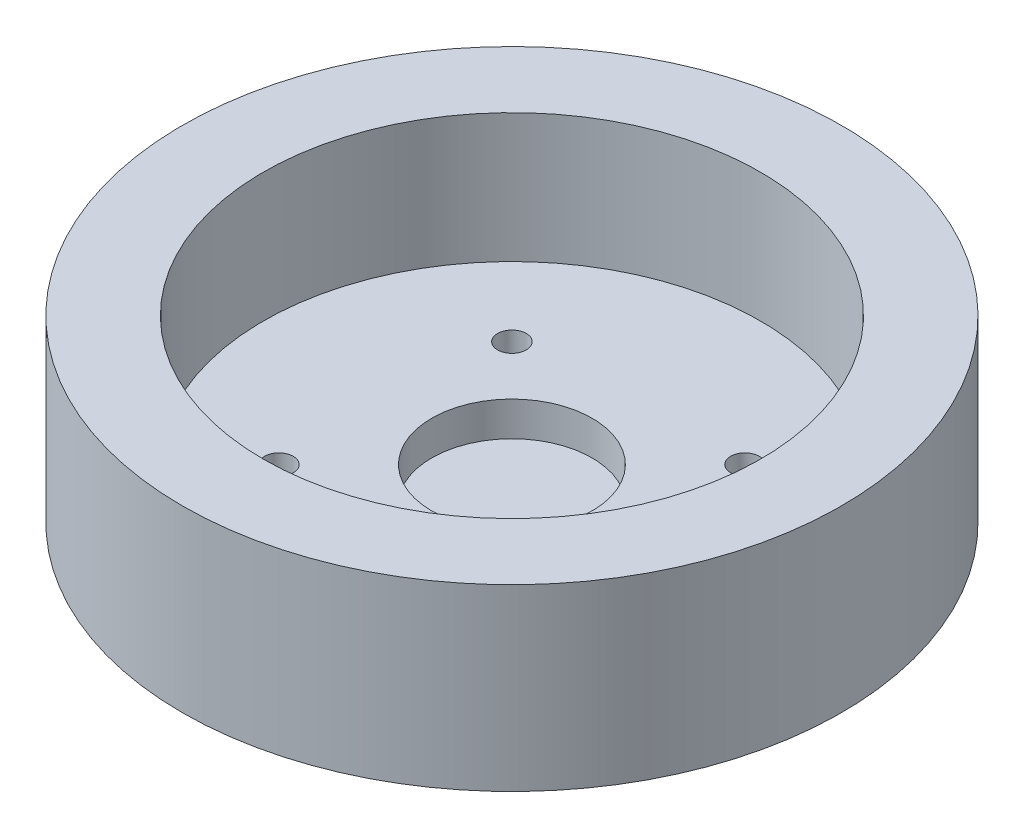
ISO-10303-21;
HEADER;
FILE_DESCRIPTION(('STEP AP214'),'2;1');
FILE_NAME('part.step','',(''),(''),'','','');
FILE_SCHEMA(('AUTOMOTIVE_DESIGN { 1 0 10303 214 1 1 1 1 }'));
ENDSEC;
DATA;
#1=APPLICATION_CONTEXT('core data for automotive mechanical design processes');
#2=APPLICATION_PROTOCOL_DEFINITION('international standard','automotive_design',2000,#1);
#3=PRODUCT_CONTEXT('',#1,'mechanical');
#4=PRODUCT('Part','Part','',(#3));
#5=PRODUCT_RELATED_PRODUCT_CATEGORY('part','',(#4));
#6=PRODUCT_DEFINITION_FORMATION('','',#4);
#7=PRODUCT_DEFINITION_CONTEXT('part definition',#1,'design');
#8=PRODUCT_DEFINITION('design','',#6,#7);
#9=PRODUCT_DEFINITION_SHAPE('','',#8);
#10=(LENGTH_UNIT() NAMED_UNIT(*) SI_UNIT(.MILLI.,.METRE.));
#11=(NAMED_UNIT(*) PLANE_ANGLE_UNIT() SI_UNIT($,.RADIAN.));
#12=(NAMED_UNIT(*) SI_UNIT($,.STERADIAN.) SOLID_ANGLE_UNIT());
#13=UNCERTAINTY_MEASURE_WITH_UNIT(LENGTH_MEASURE(1.E-05),#10,'distance_accuracy_value','');
#14=(GEOMETRIC_REPRESENTATION_CONTEXT(3) GLOBAL_UNCERTAINTY_ASSIGNED_CONTEXT((#13)) GLOBAL_UNIT_ASSIGNED_CONTEXT((#10,
#11,#12)) REPRESENTATION_CONTEXT('',''));
#15=CARTESIAN_POINT('',(0.,0.,0.));
#16=DIRECTION('',(0.,0.,1.));
#17=DIRECTION('',(1.,0.,0.));
#18=AXIS2_PLACEMENT_3D('',#15,#16,#17);
#19=CARTESIAN_POINT('',(8.13172798364529,-5.,-8.1317279836453));
#20=DIRECTION('',(0.,1.,0.));
#21=DIRECTION('',(0.,0.,1.));
#22=AXIS2_PLACEMENT_3D('',#19,#20,#21);
#23=CYLINDRICAL_SURFACE('',#22,1.);
#24=CARTESIAN_POINT('',(8.13172798364529,3.5,-8.1317279836453));
#25=DIRECTION('',(0.,1.,0.));
#26=DIRECTION('',(0.,0.,1.));
#27=AXIS2_PLACEMENT_3D('',#24,#25,#26);
#28=CIRCLE('',#27,1.);
#29=CARTESIAN_POINT('',(8.13172798364529,3.5,-7.13172798364529));
#30=VERTEX_POINT('',#29);
#31=EDGE_CURVE('E68',#30,#30,#28,.T.);
#32=ORIENTED_EDGE('',*,*,#31,.T.);
#33=EDGE_LOOP('',(#32));
#34=FACE_BOUND('',#33,.T.);
#35=CARTESIAN_POINT('',(8.13172798364529,1.9,-8.1317279836453));
#36=DIRECTION('',(0.,-1.,0.));
#37=DIRECTION('',(0.,0.,-1.));
#38=AXIS2_PLACEMENT_3D('',#35,#36,#37);
#39=CIRCLE('',#38,1.);
#40=CARTESIAN_POINT('',(8.13172798364529,1.9,-9.1317279836453));
#41=VERTEX_POINT('',#40);
#42=EDGE_CURVE('E44',#41,#41,#39,.F.);
#43=ORIENTED_EDGE('',*,*,#42,.F.);
#44=EDGE_LOOP('',(#43));
#45=FACE_BOUND('',#44,.T.);
#46=ADVANCED_FACE('F40',(#34,#45),#23,.F.);
#47=CARTESIAN_POINT('',(7.42462120245875,-5.,7.42462120245875));
#48=DIRECTION('',(0.,1.,0.));
#49=DIRECTION('',(0.,0.,1.));
#50=AXIS2_PLACEMENT_3D('',#47,#48,#49);
#51=CYLINDRICAL_SURFACE('',#50,0.999999999982254);
#52=CARTESIAN_POINT('',(7.42462120245875,3.5,7.42462120245875));
#53=DIRECTION('',(0.,1.,0.));
#54=DIRECTION('',(0.,0.,1.));
#55=AXIS2_PLACEMENT_3D('',#52,#53,#54);
#56=CIRCLE('',#55,0.999999999982254);
#57=CARTESIAN_POINT('',(7.42462120245875,3.5,8.424621202441));
#58=VERTEX_POINT('',#57);
#59=EDGE_CURVE('E72',#58,#58,#56,.T.);
#60=ORIENTED_EDGE('',*,*,#59,.T.);
#61=EDGE_LOOP('',(#60));
#62=FACE_BOUND('',#61,.T.);
#63=CARTESIAN_POINT('',(7.42462120245875,1.9,7.42462120245875));
#64=DIRECTION('',(0.,-1.,0.));
#65=DIRECTION('',(0.,0.,-1.));
#66=AXIS2_PLACEMENT_3D('',#63,#64,#65);
#67=CIRCLE('',#66,0.999999999982254);
#68=CARTESIAN_POINT('',(7.42462120245875,1.9,6.42462120247649));
#69=VERTEX_POINT('',#68);
#70=EDGE_CURVE('E63',#69,#69,#67,.F.);
#71=ORIENTED_EDGE('',*,*,#70,.F.);
#72=EDGE_LOOP('',(#71));
#73=FACE_BOUND('',#72,.T.);
#74=ADVANCED_FACE('F124',(#62,#73),#51,.F.);
#75=CARTESIAN_POINT('',(-8.13172798364529,-5.,8.1317279836453));
#76=DIRECTION('',(0.,1.,0.));
#77=DIRECTION('',(0.,0.,1.));
#78=AXIS2_PLACEMENT_3D('',#75,#76,#77);
#79=CYLINDRICAL_SURFACE('',#78,1.);
#80=CARTESIAN_POINT('',(-8.13172798364529,3.5,8.1317279836453));
#81=DIRECTION('',(0.,1.,0.));
#82=DIRECTION('',(0.,0.,1.));
#83=AXIS2_PLACEMENT_3D('',#80,#81,#82);
#84=CIRCLE('',#83,1.);
#85=CARTESIAN_POINT('',(-8.13172798364529,3.5,9.1317279836453));
#86=VERTEX_POINT('',#85);
#87=EDGE_CURVE('E77',#86,#86,#84,.T.);
#88=ORIENTED_EDGE('',*,*,#87,.T.);
#89=EDGE_LOOP('',(#88));
#90=FACE_BOUND('',#89,.T.);
#91=CARTESIAN_POINT('',(-8.13172798364529,1.9,8.1317279836453));
#92=DIRECTION('',(0.,-1.,0.));
#93=DIRECTION('',(0.,0.,-1.));
#94=AXIS2_PLACEMENT_3D('',#91,#92,#93);
#95=CIRCLE('',#94,1.);
#96=CARTESIAN_POINT('',(-8.13172798364529,1.9,7.1317279836453));
#97=VERTEX_POINT('',#96);
#98=EDGE_CURVE('E60',#97,#97,#95,.F.);
#99=ORIENTED_EDGE('',*,*,#98,.F.);
#100=EDGE_LOOP('',(#99));
#101=FACE_BOUND('',#100,.T.);
#102=ADVANCED_FACE('F129',(#90,#101),#79,.F.);
#103=CARTESIAN_POINT('',(-7.42462120245874,-5.,-7.42462120245876));
#104=DIRECTION('',(0.,1.,0.));
#105=DIRECTION('',(0.,0.,1.));
#106=AXIS2_PLACEMENT_3D('',#103,#104,#105);
#107=CYLINDRICAL_SURFACE('',#106,1.);
#108=CARTESIAN_POINT('',(-7.42462120245874,3.5,-7.42462120245876));
#109=DIRECTION('',(0.,1.,0.));
#110=DIRECTION('',(0.,0.,1.));
#111=AXIS2_PLACEMENT_3D('',#108,#109,#110);
#112=CIRCLE('',#111,1.);
#113=CARTESIAN_POINT('',(-7.42462120245874,3.5,-6.42462120245876));
#114=VERTEX_POINT('',#113);
#115=EDGE_CURVE('E85',#114,#114,#112,.T.);
#116=ORIENTED_EDGE('',*,*,#115,.T.);
#117=EDGE_LOOP('',(#116));
#118=FACE_BOUND('',#117,.T.);
#119=CARTESIAN_POINT('',(-7.42462120245874,1.9,-7.42462120245876));
#120=DIRECTION('',(0.,-1.,0.));
#121=DIRECTION('',(0.,0.,-1.));
#122=AXIS2_PLACEMENT_3D('',#119,#120,#121);
#123=CIRCLE('',#122,1.);
#124=CARTESIAN_POINT('',(-7.42462120245874,1.9,-8.42462120245876));
#125=VERTEX_POINT('',#124);
#126=EDGE_CURVE('E57',#125,#125,#123,.F.);
#127=ORIENTED_EDGE('',*,*,#126,.F.);
#128=EDGE_LOOP('',(#127));
#129=FACE_BOUND('',#128,.T.);
#130=ADVANCED_FACE('F105',(#118,#129),#107,.F.);
#131=CARTESIAN_POINT('',(0.,3.5,0.));
#132=DIRECTION('',(0.,1.,0.));
#133=DIRECTION('',(0.,0.,1.));
#134=AXIS2_PLACEMENT_3D('',#131,#132,#133);
#135=PLANE('',#134);
#136=ORIENTED_EDGE('',*,*,#115,.F.);
#137=EDGE_LOOP('',(#136));
#138=FACE_BOUND('',#137,.T.);
#139=ORIENTED_EDGE('',*,*,#87,.F.);
#140=EDGE_LOOP('',(#139));
#141=FACE_BOUND('',#140,.T.);
#142=ORIENTED_EDGE('',*,*,#59,.F.);
#143=EDGE_LOOP('',(#142));
#144=FACE_BOUND('',#143,.T.);
#145=ORIENTED_EDGE('',*,*,#31,.F.);
#146=EDGE_LOOP('',(#145));
#147=FACE_BOUND('',#146,.T.);
#148=CARTESIAN_POINT('',(0.,3.5,0.));
#149=DIRECTION('',(0.,1.,0.));
#150=DIRECTION('',(0.,0.,1.));
#151=AXIS2_PLACEMENT_3D('',#148,#149,#150);
#152=CIRCLE('',#151,17.35);
#153=CARTESIAN_POINT('',(0.,3.5,17.35));
#154=VERTEX_POINT('',#153);
#155=EDGE_CURVE('E53',#154,#154,#152,.F.);
#156=ORIENTED_EDGE('',*,*,#155,.F.);
#157=EDGE_LOOP('',(#156));
#158=FACE_BOUND('',#157,.T.);
#159=CARTESIAN_POINT('',(0.,3.5,0.));
#160=DIRECTION('',(0.,1.,0.));
#161=DIRECTION('',(0.,0.,1.));
#162=AXIS2_PLACEMENT_3D('',#159,#160,#161);
#163=CIRCLE('',#162,5.6);
#164=CARTESIAN_POINT('',(0.,3.5,5.6));
#165=VERTEX_POINT('',#164);
#166=EDGE_CURVE('E48',#165,#165,#163,.T.);
#167=ORIENTED_EDGE('',*,*,#166,.F.);
#168=EDGE_LOOP('',(#167));
#169=FACE_BOUND('',#168,.T.);
#170=ADVANCED_FACE('F102',(#138,#141,#144,#147,#158,#169),#135,.T.);
#171=CARTESIAN_POINT('',(0.,0.,0.));
#172=DIRECTION('',(0.,1.,0.));
#173=DIRECTION('',(0.,0.,1.));
#174=AXIS2_PLACEMENT_3D('',#171,#172,#173);
#175=PLANE('',#174);
#176=CARTESIAN_POINT('',(7.42462120245875,0.,7.42462120245875));
#177=DIRECTION('',(0.,-1.,0.));
#178=DIRECTION('',(0.,0.,-1.));
#179=AXIS2_PLACEMENT_3D('',#176,#177,#178);
#180=CIRCLE('',#179,1.91);
#181=CARTESIAN_POINT('',(7.42462120245875,0.,5.51462120245875));
#182=VERTEX_POINT('',#181);
#183=EDGE_CURVE('E328',#182,#182,#180,.T.);
#184=ORIENTED_EDGE('',*,*,#183,.F.);
#185=EDGE_LOOP('',(#184));
#186=FACE_BOUND('',#185,.T.);
#187=CARTESIAN_POINT('',(-7.42462120245874,0.,-7.42462120245876));
#188=DIRECTION('',(0.,-1.,0.));
#189=DIRECTION('',(0.,0.,-1.));
#190=AXIS2_PLACEMENT_3D('',#187,#188,#189);
#191=CIRCLE('',#190,1.91);
#192=CARTESIAN_POINT('',(-7.42462120245874,0.,-9.33462120245876));
#193=VERTEX_POINT('',#192);
#194=EDGE_CURVE('E322',#193,#193,#191,.T.);
#195=ORIENTED_EDGE('',*,*,#194,.F.);
#196=EDGE_LOOP('',(#195));
#197=FACE_BOUND('',#196,.T.);
#198=CARTESIAN_POINT('',(8.13172798364529,0.,-8.1317279836453));
#199=DIRECTION('',(0.,-1.,0.));
#200=DIRECTION('',(0.,0.,-1.));
#201=AXIS2_PLACEMENT_3D('',#198,#199,#200);
#202=CIRCLE('',#201,1.91);
#203=CARTESIAN_POINT('',(8.13172798364529,0.,-10.0417279836453));
#204=VERTEX_POINT('',#203);
#205=EDGE_CURVE('E319',#204,#204,#202,.T.);
#206=ORIENTED_EDGE('',*,*,#205,.F.);
#207=EDGE_LOOP('',(#206));
#208=FACE_BOUND('',#207,.T.);
#209=CARTESIAN_POINT('',(-8.13172798364529,0.,8.1317279836453));
#210=DIRECTION('',(0.,-1.,0.));
#211=DIRECTION('',(0.,0.,-1.));
#212=AXIS2_PLACEMENT_3D('',#209,#210,#211);
#213=CIRCLE('',#212,1.91);
#214=CARTESIAN_POINT('',(-8.13172798364529,0.,6.2217279836453));
#215=VERTEX_POINT('',#214);
#216=EDGE_CURVE('E80',#215,#215,#213,.T.);
#217=ORIENTED_EDGE('',*,*,#216,.F.);
#218=EDGE_LOOP('',(#217));
#219=FACE_BOUND('',#218,.T.);
#220=CARTESIAN_POINT('',(0.,0.,0.));
#221=DIRECTION('',(0.,1.,0.));
#222=DIRECTION('',(0.,0.,1.));
#223=AXIS2_PLACEMENT_3D('',#220,#221,#222);
#224=CIRCLE('',#223,23.);
#225=CARTESIAN_POINT('',(0.,0.,23.));
#226=VERTEX_POINT('',#225);
#227=EDGE_CURVE('E91',#226,#226,#224,.T.);
#228=ORIENTED_EDGE('',*,*,#227,.F.);
#229=EDGE_LOOP('',(#228));
#230=FACE_BOUND('',#229,.T.);
#231=ADVANCED_FACE('F42',(#186,#197,#208,#219,#230),#175,.F.);
#232=CARTESIAN_POINT('',(0.,3.5,0.));
#233=DIRECTION('',(0.,-1.,0.));
#234=DIRECTION('',(0.,0.,-1.));
#235=AXIS2_PLACEMENT_3D('',#232,#233,#234);
#236=CYLINDRICAL_SURFACE('',#235,5.6);
#237=CARTESIAN_POINT('',(0.,1.1,0.));
#238=DIRECTION('',(0.,1.,0.));
#239=DIRECTION('',(0.,0.,1.));
#240=AXIS2_PLACEMENT_3D('',#237,#238,#239);
#241=CIRCLE('',#240,5.6);
#242=CARTESIAN_POINT('',(0.,1.1,5.6));
#243=VERTEX_POINT('',#242);
#244=EDGE_CURVE('E11',#243,#243,#241,.T.);
#245=ORIENTED_EDGE('',*,*,#244,.F.);
#246=EDGE_LOOP('',(#245));
#247=FACE_BOUND('',#246,.T.);
#248=ORIENTED_EDGE('',*,*,#166,.T.);
#249=EDGE_LOOP('',(#248));
#250=FACE_BOUND('',#249,.T.);
#251=ADVANCED_FACE('F109',(#247,#250),#236,.F.);
#252=CARTESIAN_POINT('',(0.,12.5,0.));
#253=DIRECTION('',(0.,1.,0.));
#254=DIRECTION('',(0.,0.,1.));
#255=AXIS2_PLACEMENT_3D('',#252,#253,#254);
#256=PLANE('',#255);
#257=CARTESIAN_POINT('',(0.,12.5,0.));
#258=DIRECTION('',(0.,1.,0.));
#259=DIRECTION('',(0.,0.,1.));
#260=AXIS2_PLACEMENT_3D('',#257,#258,#259);
#261=CIRCLE('',#260,23.);
#262=CARTESIAN_POINT('',(0.,12.5,23.));
#263=VERTEX_POINT('',#262);
#264=EDGE_CURVE('E92',#263,#263,#261,.T.);
#265=ORIENTED_EDGE('',*,*,#264,.T.);
#266=EDGE_LOOP('',(#265));
#267=FACE_BOUND('',#266,.T.);
#268=CARTESIAN_POINT('',(0.,12.5,0.));
#269=DIRECTION('',(0.,1.,0.));
#270=DIRECTION('',(0.,0.,1.));
#271=AXIS2_PLACEMENT_3D('',#268,#269,#270);
#272=CIRCLE('',#271,17.35);
#273=CARTESIAN_POINT('',(0.,12.5,17.35));
#274=VERTEX_POINT('',#273);
#275=EDGE_CURVE('E88',#274,#274,#272,.T.);
#276=ORIENTED_EDGE('',*,*,#275,.F.);
#277=EDGE_LOOP('',(#276));
#278=FACE_BOUND('',#277,.T.);
#279=ADVANCED_FACE('F111',(#267,#278),#256,.T.);
#280=CARTESIAN_POINT('',(0.,12.5,0.));
#281=DIRECTION('',(0.,-1.,0.));
#282=DIRECTION('',(0.,0.,-1.));
#283=AXIS2_PLACEMENT_3D('',#280,#281,#282);
#284=CYLINDRICAL_SURFACE('',#283,23.);
#285=ORIENTED_EDGE('',*,*,#264,.F.);
#286=EDGE_LOOP('',(#285));
#287=FACE_BOUND('',#286,.T.);
#288=ORIENTED_EDGE('',*,*,#227,.T.);
#289=EDGE_LOOP('',(#288));
#290=FACE_BOUND('',#289,.T.);
#291=ADVANCED_FACE('F118',(#287,#290),#284,.T.);
#292=CARTESIAN_POINT('',(0.,12.5,0.));
#293=DIRECTION('',(0.,-1.,0.));
#294=DIRECTION('',(0.,0.,-1.));
#295=AXIS2_PLACEMENT_3D('',#292,#293,#294);
#296=CYLINDRICAL_SURFACE('',#295,17.35);
#297=ORIENTED_EDGE('',*,*,#155,.T.);
#298=EDGE_LOOP('',(#297));
#299=FACE_BOUND('',#298,.T.);
#300=ORIENTED_EDGE('',*,*,#275,.T.);
#301=EDGE_LOOP('',(#300));
#302=FACE_BOUND('',#301,.T.);
#303=ADVANCED_FACE('F99',(#299,#302),#296,.F.);
#304=CARTESIAN_POINT('',(0.,1.1,0.));
#305=DIRECTION('',(0.,1.,0.));
#306=DIRECTION('',(0.,0.,1.));
#307=AXIS2_PLACEMENT_3D('',#304,#305,#306);
#308=PLANE('',#307);
#309=ORIENTED_EDGE('',*,*,#244,.T.);
#310=EDGE_LOOP('',(#309));
#311=FACE_BOUND('',#310,.T.);
#312=ADVANCED_FACE('F136',(#311),#308,.T.);
#313=CARTESIAN_POINT('',(-7.42462120245874,1.9,-7.42462120245876));
#314=DIRECTION('',(0.,-1.,0.));
#315=DIRECTION('',(0.,0.,-1.));
#316=AXIS2_PLACEMENT_3D('',#313,#314,#315);
#317=PLANE('',#316);
#318=CARTESIAN_POINT('',(-7.42462120245874,1.9,-7.42462120245876));
#319=DIRECTION('',(0.,-1.,0.));
#320=DIRECTION('',(0.,0.,-1.));
#321=AXIS2_PLACEMENT_3D('',#318,#319,#320);
#322=CIRCLE('',#321,1.91);
#323=CARTESIAN_POINT('',(-7.42462120245874,1.9,-9.33462120245876));
#324=VERTEX_POINT('',#323);
#325=EDGE_CURVE('E331',#324,#324,#322,.T.);
#326=ORIENTED_EDGE('',*,*,#325,.T.);
#327=EDGE_LOOP('',(#326));
#328=FACE_BOUND('',#327,.T.);
#329=ORIENTED_EDGE('',*,*,#126,.T.);
#330=EDGE_LOOP('',(#329));
#331=FACE_BOUND('',#330,.T.);
#332=ADVANCED_FACE('F139',(#328,#331),#317,.T.);
#333=CARTESIAN_POINT('',(-7.42462120245874,1.9,-7.42462120245876));
#334=DIRECTION('',(0.,-1.,0.));
#335=DIRECTION('',(0.,0.,-1.));
#336=AXIS2_PLACEMENT_3D('',#333,#334,#335);
#337=CYLINDRICAL_SURFACE('',#336,1.91);
#338=CARTESIAN_POINT('',(-7.42462120245874,1.9,-9.33462120245876));
#339=CARTESIAN_POINT('',(-7.42462120245874,1.88020833333333,-9.33462120245876));
#340=CARTESIAN_POINT('',(-7.42462120245874,1.86041666666667,-9.33462120245876));
#341=CARTESIAN_POINT('',(-7.42462120245874,1.82083333333333,-9.33462120245876));
#342=CARTESIAN_POINT('',(-7.42462120245874,1.80104166666667,-9.33462120245876));
#343=CARTESIAN_POINT('',(-7.42462120245874,1.76145833333333,-9.33462120245876));
#344=CARTESIAN_POINT('',(-7.42462120245874,1.74166666666667,-9.33462120245876));
#345=CARTESIAN_POINT('',(-7.42462120245874,1.70208333333333,-9.33462120245876));
#346=CARTESIAN_POINT('',(-7.42462120245874,1.68229166666667,-9.33462120245876));
#347=CARTESIAN_POINT('',(-7.42462120245874,1.64270833333333,-9.33462120245876));
#348=CARTESIAN_POINT('',(-7.42462120245874,1.62291666666667,-9.33462120245876));
#349=CARTESIAN_POINT('',(-7.42462120245874,1.58333333333333,-9.33462120245876));
#350=CARTESIAN_POINT('',(-7.42462120245874,1.56354166666667,-9.33462120245876));
#351=CARTESIAN_POINT('',(-7.42462120245874,1.52395833333333,-9.33462120245876));
#352=CARTESIAN_POINT('',(-7.42462120245874,1.50416666666667,-9.33462120245876));
#353=CARTESIAN_POINT('',(-7.42462120245874,1.46458333333333,-9.33462120245876));
#354=CARTESIAN_POINT('',(-7.42462120245874,1.44479166666667,-9.33462120245876));
#355=CARTESIAN_POINT('',(-7.42462120245874,1.40520833333333,-9.33462120245876));
#356=CARTESIAN_POINT('',(-7.42462120245874,1.38541666666667,-9.33462120245876));
#357=CARTESIAN_POINT('',(-7.42462120245874,1.34583333333333,-9.33462120245876));
#358=CARTESIAN_POINT('',(-7.42462120245874,1.32604166666667,-9.33462120245876));
#359=CARTESIAN_POINT('',(-7.42462120245874,1.28645833333333,-9.33462120245876));
#360=CARTESIAN_POINT('',(-7.42462120245874,1.26666666666667,-9.33462120245876));
#361=CARTESIAN_POINT('',(-7.42462120245874,1.22708333333333,-9.33462120245876));
#362=CARTESIAN_POINT('',(-7.42462120245874,1.20729166666667,-9.33462120245876));
#363=CARTESIAN_POINT('',(-7.42462120245874,1.16770833333333,-9.33462120245876));
#364=CARTESIAN_POINT('',(-7.42462120245874,1.14791666666667,-9.33462120245876));
#365=CARTESIAN_POINT('',(-7.42462120245874,1.10833333333333,-9.33462120245876));
#366=CARTESIAN_POINT('',(-7.42462120245874,1.08854166666667,-9.33462120245876));
#367=CARTESIAN_POINT('',(-7.42462120245874,1.04895833333333,-9.33462120245876));
#368=CARTESIAN_POINT('',(-7.42462120245874,1.02916666666667,-9.33462120245876));
#369=CARTESIAN_POINT('',(-7.42462120245874,0.989583333333333,-9.33462120245876));
#370=CARTESIAN_POINT('',(-7.42462120245874,0.969791666666667,-9.33462120245876));
#371=CARTESIAN_POINT('',(-7.42462120245874,0.930208333333333,-9.33462120245876));
#372=CARTESIAN_POINT('',(-7.42462120245874,0.910416666666667,-9.33462120245876));
#373=CARTESIAN_POINT('',(-7.42462120245874,0.870833333333333,-9.33462120245876));
#374=CARTESIAN_POINT('',(-7.42462120245874,0.851041666666667,-9.33462120245876));
#375=CARTESIAN_POINT('',(-7.42462120245874,0.811458333333334,-9.33462120245876));
#376=CARTESIAN_POINT('',(-7.42462120245874,0.791666666666667,-9.33462120245876));
#377=CARTESIAN_POINT('',(-7.42462120245874,0.752083333333334,-9.33462120245876));
#378=CARTESIAN_POINT('',(-7.42462120245874,0.732291666666667,-9.33462120245876));
#379=CARTESIAN_POINT('',(-7.42462120245874,0.692708333333333,-9.33462120245876));
#380=CARTESIAN_POINT('',(-7.42462120245874,0.672916666666667,-9.33462120245876));
#381=CARTESIAN_POINT('',(-7.42462120245874,0.633333333333333,-9.33462120245876));
#382=CARTESIAN_POINT('',(-7.42462120245874,0.613541666666667,-9.33462120245876));
#383=CARTESIAN_POINT('',(-7.42462120245874,0.573958333333333,-9.33462120245876));
#384=CARTESIAN_POINT('',(-7.42462120245874,0.554166666666667,-9.33462120245876));
#385=CARTESIAN_POINT('',(-7.42462120245874,0.514583333333334,-9.33462120245876));
#386=CARTESIAN_POINT('',(-7.42462120245874,0.494791666666667,-9.33462120245876));
#387=CARTESIAN_POINT('',(-7.42462120245874,0.455208333333333,-9.33462120245876));
#388=CARTESIAN_POINT('',(-7.42462120245874,0.435416666666667,-9.33462120245876));
#389=CARTESIAN_POINT('',(-7.42462120245874,0.395833333333333,-9.33462120245876));
#390=CARTESIAN_POINT('',(-7.42462120245874,0.376041666666667,-9.33462120245876));
#391=CARTESIAN_POINT('',(-7.42462120245874,0.336458333333333,-9.33462120245876));
#392=CARTESIAN_POINT('',(-7.42462120245874,0.316666666666667,-9.33462120245876));
#393=CARTESIAN_POINT('',(-7.42462120245874,0.277083333333333,-9.33462120245876));
#394=CARTESIAN_POINT('',(-7.42462120245874,0.257291666666667,-9.33462120245876));
#395=CARTESIAN_POINT('',(-7.42462120245874,0.217708333333333,-9.33462120245876));
#396=CARTESIAN_POINT('',(-7.42462120245874,0.197916666666667,-9.33462120245876));
#397=CARTESIAN_POINT('',(-7.42462120245874,0.158333333333333,-9.33462120245876));
#398=CARTESIAN_POINT('',(-7.42462120245874,0.138541666666667,-9.33462120245876));
#399=CARTESIAN_POINT('',(-7.42462120245874,0.0989583333333333,-9.33462120245876));
#400=CARTESIAN_POINT('',(-7.42462120245874,0.0791666666666666,-9.33462120245876));
#401=CARTESIAN_POINT('',(-7.42462120245874,0.0395833333333333,-9.33462120245876));
#402=CARTESIAN_POINT('',(-7.42462120245874,0.0197916666666666,-9.33462120245876));
#403=CARTESIAN_POINT('',(-7.42462120245874,0.,-9.33462120245876));
#404=B_SPLINE_CURVE_WITH_KNOTS('',3,(#338,#339,#340,#341,#342,#343,#344,#345,#346,#347,#348,
#349,#350,#351,#352,#353,#354,#355,#356,#357,#358,#359,#360,#361,#362,#363,#364,#365,#366,#367,
#368,#369,#370,#371,#372,#373,#374,#375,#376,#377,#378,#379,#380,#381,#382,#383,#384,#385,#386,
#387,#388,#389,#390,#391,#392,#393,#394,#395,#396,#397,#398,#399,#400,#401,#402,#403),
.UNSPECIFIED.,.F.,.F.,(4,2,2,2,2,2,2,2,2,2,2,2,2,2,2,2,2,2,2,2,2,2,2,2,2,2,2,2,2,2,2,2,4),(0.,
0.0593750000000002,0.11875,0.178125,0.2375,0.296875,0.35625,0.415625,0.475,0.534375,0.59375,
0.653125,0.7125,0.771875,0.83125,0.890625,0.95,1.009375,1.06875,1.128125,1.1875,1.246875,
1.30625,1.365625,1.425,1.484375,1.54375,1.603125,1.6625,1.721875,1.78125,1.840625,1.9),.UNSPECIFIED.);
#405=EDGE_CURVE('BSEAM168',#324,#193,#404,.T.);
#406=ORIENTED_EDGE('',*,*,#325,.F.);
#407=ORIENTED_EDGE('',*,*,#194,.T.);
#408=ORIENTED_EDGE('',*,*,#405,.T.);
#409=ORIENTED_EDGE('',*,*,#405,.F.);
#410=EDGE_LOOP('',(#406,#408,#407,#409));
#411=FACE_BOUND('',#410,.T.);
#412=ADVANCED_FACE('F168',(#411),#337,.F.);
#413=CARTESIAN_POINT('',(-8.13172798364529,1.9,8.1317279836453));
#414=DIRECTION('',(0.,-1.,0.));
#415=DIRECTION('',(0.,0.,-1.));
#416=AXIS2_PLACEMENT_3D('',#413,#414,#415);
#417=PLANE('',#416);
#418=CARTESIAN_POINT('',(-8.13172798364529,1.9,8.1317279836453));
#419=DIRECTION('',(0.,-1.,0.));
#420=DIRECTION('',(0.,0.,-1.));
#421=AXIS2_PLACEMENT_3D('',#418,#419,#420);
#422=CIRCLE('',#421,1.91);
#423=CARTESIAN_POINT('',(-8.13172798364529,1.9,6.2217279836453));
#424=VERTEX_POINT('',#423);
#425=EDGE_CURVE('E61',#424,#424,#422,.T.);
#426=ORIENTED_EDGE('',*,*,#425,.T.);
#427=EDGE_LOOP('',(#426));
#428=FACE_BOUND('',#427,.T.);
#429=ORIENTED_EDGE('',*,*,#98,.T.);
#430=EDGE_LOOP('',(#429));
#431=FACE_BOUND('',#430,.T.);
#432=ADVANCED_FACE('F177',(#428,#431),#417,.T.);
#433=CARTESIAN_POINT('',(-8.13172798364529,1.9,8.1317279836453));
#434=DIRECTION('',(0.,-1.,0.));
#435=DIRECTION('',(0.,0.,-1.));
#436=AXIS2_PLACEMENT_3D('',#433,#434,#435);
#437=CYLINDRICAL_SURFACE('',#436,1.91);
#438=CARTESIAN_POINT('',(-8.13172798364529,1.9,6.2217279836453));
#439=CARTESIAN_POINT('',(-8.13172798364529,1.88020833333333,6.2217279836453));
#440=CARTESIAN_POINT('',(-8.13172798364529,1.86041666666667,6.2217279836453));
#441=CARTESIAN_POINT('',(-8.13172798364529,1.82083333333333,6.2217279836453));
#442=CARTESIAN_POINT('',(-8.13172798364529,1.80104166666667,6.2217279836453));
#443=CARTESIAN_POINT('',(-8.13172798364529,1.76145833333333,6.2217279836453));
#444=CARTESIAN_POINT('',(-8.13172798364529,1.74166666666667,6.2217279836453));
#445=CARTESIAN_POINT('',(-8.13172798364529,1.70208333333333,6.2217279836453));
#446=CARTESIAN_POINT('',(-8.13172798364529,1.68229166666667,6.2217279836453));
#447=CARTESIAN_POINT('',(-8.13172798364529,1.64270833333333,6.2217279836453));
#448=CARTESIAN_POINT('',(-8.13172798364529,1.62291666666667,6.2217279836453));
#449=CARTESIAN_POINT('',(-8.13172798364529,1.58333333333333,6.2217279836453));
#450=CARTESIAN_POINT('',(-8.13172798364529,1.56354166666667,6.2217279836453));
#451=CARTESIAN_POINT('',(-8.13172798364529,1.52395833333333,6.2217279836453));
#452=CARTESIAN_POINT('',(-8.13172798364529,1.50416666666667,6.2217279836453));
#453=CARTESIAN_POINT('',(-8.13172798364529,1.46458333333333,6.2217279836453));
#454=CARTESIAN_POINT('',(-8.13172798364529,1.44479166666667,6.2217279836453));
#455=CARTESIAN_POINT('',(-8.13172798364529,1.40520833333333,6.2217279836453));
#456=CARTESIAN_POINT('',(-8.13172798364529,1.38541666666667,6.2217279836453));
#457=CARTESIAN_POINT('',(-8.13172798364529,1.34583333333333,6.2217279836453));
#458=CARTESIAN_POINT('',(-8.13172798364529,1.32604166666667,6.2217279836453));
#459=CARTESIAN_POINT('',(-8.13172798364529,1.28645833333333,6.2217279836453));
#460=CARTESIAN_POINT('',(-8.13172798364529,1.26666666666667,6.2217279836453));
#461=CARTESIAN_POINT('',(-8.13172798364529,1.22708333333333,6.2217279836453));
#462=CARTESIAN_POINT('',(-8.13172798364529,1.20729166666667,6.2217279836453));
#463=CARTESIAN_POINT('',(-8.13172798364529,1.16770833333333,6.2217279836453));
#464=CARTESIAN_POINT('',(-8.13172798364529,1.14791666666667,6.2217279836453));
#465=CARTESIAN_POINT('',(-8.13172798364529,1.10833333333333,6.2217279836453));
#466=CARTESIAN_POINT('',(-8.13172798364529,1.08854166666667,6.2217279836453));
#467=CARTESIAN_POINT('',(-8.13172798364529,1.04895833333333,6.2217279836453));
#468=CARTESIAN_POINT('',(-8.13172798364529,1.02916666666667,6.2217279836453));
#469=CARTESIAN_POINT('',(-8.13172798364529,0.989583333333333,6.2217279836453));
#470=CARTESIAN_POINT('',(-8.13172798364529,0.969791666666667,6.2217279836453));
#471=CARTESIAN_POINT('',(-8.13172798364529,0.930208333333333,6.2217279836453));
#472=CARTESIAN_POINT('',(-8.13172798364529,0.910416666666667,6.2217279836453));
#473=CARTESIAN_POINT('',(-8.13172798364529,0.870833333333333,6.2217279836453));
#474=CARTESIAN_POINT('',(-8.13172798364529,0.851041666666667,6.2217279836453));
#475=CARTESIAN_POINT('',(-8.13172798364529,0.811458333333334,6.2217279836453));
#476=CARTESIAN_POINT('',(-8.13172798364529,0.791666666666667,6.2217279836453));
#477=CARTESIAN_POINT('',(-8.13172798364529,0.752083333333334,6.2217279836453));
#478=CARTESIAN_POINT('',(-8.13172798364529,0.732291666666667,6.2217279836453));
#479=CARTESIAN_POINT('',(-8.13172798364529,0.692708333333333,6.2217279836453));
#480=CARTESIAN_POINT('',(-8.13172798364529,0.672916666666667,6.2217279836453));
#481=CARTESIAN_POINT('',(-8.13172798364529,0.633333333333333,6.2217279836453));
#482=CARTESIAN_POINT('',(-8.13172798364529,0.613541666666667,6.2217279836453));
#483=CARTESIAN_POINT('',(-8.13172798364529,0.573958333333333,6.2217279836453));
#484=CARTESIAN_POINT('',(-8.13172798364529,0.554166666666667,6.2217279836453));
#485=CARTESIAN_POINT('',(-8.13172798364529,0.514583333333334,6.2217279836453));
#486=CARTESIAN_POINT('',(-8.13172798364529,0.494791666666667,6.2217279836453));
#487=CARTESIAN_POINT('',(-8.13172798364529,0.455208333333333,6.2217279836453));
#488=CARTESIAN_POINT('',(-8.13172798364529,0.435416666666667,6.2217279836453));
#489=CARTESIAN_POINT('',(-8.13172798364529,0.395833333333333,6.2217279836453));
#490=CARTESIAN_POINT('',(-8.13172798364529,0.376041666666667,6.2217279836453));
#491=CARTESIAN_POINT('',(-8.13172798364529,0.336458333333333,6.2217279836453));
#492=CARTESIAN_POINT('',(-8.13172798364529,0.316666666666667,6.2217279836453));
#493=CARTESIAN_POINT('',(-8.13172798364529,0.277083333333333,6.2217279836453));
#494=CARTESIAN_POINT('',(-8.13172798364529,0.257291666666667,6.2217279836453));
#495=CARTESIAN_POINT('',(-8.13172798364529,0.217708333333333,6.2217279836453));
#496=CARTESIAN_POINT('',(-8.13172798364529,0.197916666666667,6.2217279836453));
#497=CARTESIAN_POINT('',(-8.13172798364529,0.158333333333333,6.2217279836453));
#498=CARTESIAN_POINT('',(-8.13172798364529,0.138541666666667,6.2217279836453));
#499=CARTESIAN_POINT('',(-8.13172798364529,0.0989583333333333,6.2217279836453));
#500=CARTESIAN_POINT('',(-8.13172798364529,0.0791666666666666,6.2217279836453));
#501=CARTESIAN_POINT('',(-8.13172798364529,0.0395833333333333,6.2217279836453));
#502=CARTESIAN_POINT('',(-8.13172798364529,0.0197916666666666,6.2217279836453));
#503=CARTESIAN_POINT('',(-8.13172798364529,0.,6.2217279836453));
#504=B_SPLINE_CURVE_WITH_KNOTS('',3,(#438,#439,#440,#441,#442,#443,#444,#445,#446,#447,#448,
#449,#450,#451,#452,#453,#454,#455,#456,#457,#458,#459,#460,#461,#462,#463,#464,#465,#466,#467,
#468,#469,#470,#471,#472,#473,#474,#475,#476,#477,#478,#479,#480,#481,#482,#483,#484,#485,#486,
#487,#488,#489,#490,#491,#492,#493,#494,#495,#496,#497,#498,#499,#500,#501,#502,#503),
.UNSPECIFIED.,.F.,.F.,(4,2,2,2,2,2,2,2,2,2,2,2,2,2,2,2,2,2,2,2,2,2,2,2,2,2,2,2,2,2,2,2,4),(0.,
0.0593750000000002,0.11875,0.178125,0.2375,0.296875,0.35625,0.415625,0.475,0.534375,0.59375,
0.653125,0.7125,0.771875,0.83125,0.890625,0.95,1.009375,1.06875,1.128125,1.1875,1.246875,
1.30625,1.365625,1.425,1.484375,1.54375,1.603125,1.6625,1.721875,1.78125,1.840625,1.9),.UNSPECIFIED.);
#505=EDGE_CURVE('BSEAM185',#424,#215,#504,.T.);
#506=ORIENTED_EDGE('',*,*,#425,.F.);
#507=ORIENTED_EDGE('',*,*,#216,.T.);
#508=ORIENTED_EDGE('',*,*,#505,.T.);
#509=ORIENTED_EDGE('',*,*,#505,.F.);
#510=EDGE_LOOP('',(#506,#508,#507,#509));
#511=FACE_BOUND('',#510,.T.);
#512=ADVANCED_FACE('F185',(#511),#437,.F.);
#513=CARTESIAN_POINT('',(7.42462120245875,1.9,7.42462120245875));
#514=DIRECTION('',(0.,-1.,0.));
#515=DIRECTION('',(0.,0.,-1.));
#516=AXIS2_PLACEMENT_3D('',#513,#514,#515);
#517=PLANE('',#516);
#518=CARTESIAN_POINT('',(7.42462120245875,1.9,7.42462120245875));
#519=DIRECTION('',(0.,-1.,0.));
#520=DIRECTION('',(0.,0.,-1.));
#521=AXIS2_PLACEMENT_3D('',#518,#519,#520);
#522=CIRCLE('',#521,1.91);
#523=CARTESIAN_POINT('',(7.42462120245875,1.9,5.51462120245875));
#524=VERTEX_POINT('',#523);
#525=EDGE_CURVE('E325',#524,#524,#522,.T.);
#526=ORIENTED_EDGE('',*,*,#525,.T.);
#527=EDGE_LOOP('',(#526));
#528=FACE_BOUND('',#527,.T.);
#529=ORIENTED_EDGE('',*,*,#70,.T.);
#530=EDGE_LOOP('',(#529));
#531=FACE_BOUND('',#530,.T.);
#532=ADVANCED_FACE('F193',(#528,#531),#517,.T.);
#533=CARTESIAN_POINT('',(7.42462120245875,1.9,7.42462120245875));
#534=DIRECTION('',(0.,-1.,0.));
#535=DIRECTION('',(0.,0.,-1.));
#536=AXIS2_PLACEMENT_3D('',#533,#534,#535);
#537=CYLINDRICAL_SURFACE('',#536,1.91);
#538=CARTESIAN_POINT('',(7.42462120245875,1.9,5.51462120245875));
#539=CARTESIAN_POINT('',(7.42462120245875,1.88020833333333,5.51462120245875));
#540=CARTESIAN_POINT('',(7.42462120245875,1.86041666666667,5.51462120245875));
#541=CARTESIAN_POINT('',(7.42462120245875,1.82083333333333,5.51462120245875));
#542=CARTESIAN_POINT('',(7.42462120245875,1.80104166666667,5.51462120245875));
#543=CARTESIAN_POINT('',(7.42462120245875,1.76145833333333,5.51462120245875));
#544=CARTESIAN_POINT('',(7.42462120245875,1.74166666666667,5.51462120245875));
#545=CARTESIAN_POINT('',(7.42462120245875,1.70208333333333,5.51462120245875));
#546=CARTESIAN_POINT('',(7.42462120245875,1.68229166666667,5.51462120245875));
#547=CARTESIAN_POINT('',(7.42462120245875,1.64270833333333,5.51462120245875));
#548=CARTESIAN_POINT('',(7.42462120245875,1.62291666666667,5.51462120245875));
#549=CARTESIAN_POINT('',(7.42462120245875,1.58333333333333,5.51462120245875));
#550=CARTESIAN_POINT('',(7.42462120245875,1.56354166666667,5.51462120245875));
#551=CARTESIAN_POINT('',(7.42462120245875,1.52395833333333,5.51462120245875));
#552=CARTESIAN_POINT('',(7.42462120245875,1.50416666666667,5.51462120245875));
#553=CARTESIAN_POINT('',(7.42462120245875,1.46458333333333,5.51462120245875));
#554=CARTESIAN_POINT('',(7.42462120245875,1.44479166666667,5.51462120245875));
#555=CARTESIAN_POINT('',(7.42462120245875,1.40520833333333,5.51462120245875));
#556=CARTESIAN_POINT('',(7.42462120245875,1.38541666666667,5.51462120245875));
#557=CARTESIAN_POINT('',(7.42462120245875,1.34583333333333,5.51462120245875));
#558=CARTESIAN_POINT('',(7.42462120245875,1.32604166666667,5.51462120245875));
#559=CARTESIAN_POINT('',(7.42462120245875,1.28645833333333,5.51462120245875));
#560=CARTESIAN_POINT('',(7.42462120245875,1.26666666666667,5.51462120245875));
#561=CARTESIAN_POINT('',(7.42462120245875,1.22708333333333,5.51462120245875));
#562=CARTESIAN_POINT('',(7.42462120245875,1.20729166666667,5.51462120245875));
#563=CARTESIAN_POINT('',(7.42462120245875,1.16770833333333,5.51462120245875));
#564=CARTESIAN_POINT('',(7.42462120245875,1.14791666666667,5.51462120245875));
#565=CARTESIAN_POINT('',(7.42462120245875,1.10833333333333,5.51462120245875));
#566=CARTESIAN_POINT('',(7.42462120245875,1.08854166666667,5.51462120245875));
#567=CARTESIAN_POINT('',(7.42462120245875,1.04895833333333,5.51462120245875));
#568=CARTESIAN_POINT('',(7.42462120245875,1.02916666666667,5.51462120245875));
#569=CARTESIAN_POINT('',(7.42462120245875,0.989583333333333,5.51462120245875));
#570=CARTESIAN_POINT('',(7.42462120245875,0.969791666666667,5.51462120245875));
#571=CARTESIAN_POINT('',(7.42462120245875,0.930208333333333,5.51462120245875));
#572=CARTESIAN_POINT('',(7.42462120245875,0.910416666666667,5.51462120245875));
#573=CARTESIAN_POINT('',(7.42462120245875,0.870833333333333,5.51462120245875));
#574=CARTESIAN_POINT('',(7.42462120245875,0.851041666666667,5.51462120245875));
#575=CARTESIAN_POINT('',(7.42462120245875,0.811458333333334,5.51462120245875));
#576=CARTESIAN_POINT('',(7.42462120245875,0.791666666666667,5.51462120245875));
#577=CARTESIAN_POINT('',(7.42462120245875,0.752083333333334,5.51462120245875));
#578=CARTESIAN_POINT('',(7.42462120245875,0.732291666666667,5.51462120245875));
#579=CARTESIAN_POINT('',(7.42462120245875,0.692708333333333,5.51462120245875));
#580=CARTESIAN_POINT('',(7.42462120245875,0.672916666666667,5.51462120245875));
#581=CARTESIAN_POINT('',(7.42462120245875,0.633333333333333,5.51462120245875));
#582=CARTESIAN_POINT('',(7.42462120245875,0.613541666666667,5.51462120245875));
#583=CARTESIAN_POINT('',(7.42462120245875,0.573958333333333,5.51462120245875));
#584=CARTESIAN_POINT('',(7.42462120245875,0.554166666666667,5.51462120245875));
#585=CARTESIAN_POINT('',(7.42462120245875,0.514583333333334,5.51462120245875));
#586=CARTESIAN_POINT('',(7.42462120245875,0.494791666666667,5.51462120245875));
#587=CARTESIAN_POINT('',(7.42462120245875,0.455208333333333,5.51462120245875));
#588=CARTESIAN_POINT('',(7.42462120245875,0.435416666666667,5.51462120245875));
#589=CARTESIAN_POINT('',(7.42462120245875,0.395833333333333,5.51462120245875));
#590=CARTESIAN_POINT('',(7.42462120245875,0.376041666666667,5.51462120245875));
#591=CARTESIAN_POINT('',(7.42462120245875,0.336458333333333,5.51462120245875));
#592=CARTESIAN_POINT('',(7.42462120245875,0.316666666666667,5.51462120245875));
#593=CARTESIAN_POINT('',(7.42462120245875,0.277083333333333,5.51462120245875));
#594=CARTESIAN_POINT('',(7.42462120245875,0.257291666666667,5.51462120245875));
#595=CARTESIAN_POINT('',(7.42462120245875,0.217708333333333,5.51462120245875));
#596=CARTESIAN_POINT('',(7.42462120245875,0.197916666666667,5.51462120245875));
#597=CARTESIAN_POINT('',(7.42462120245875,0.158333333333333,5.51462120245875));
#598=CARTESIAN_POINT('',(7.42462120245875,0.138541666666667,5.51462120245875));
#599=CARTESIAN_POINT('',(7.42462120245875,0.0989583333333333,5.51462120245875));
#600=CARTESIAN_POINT('',(7.42462120245875,0.0791666666666666,5.51462120245875));
#601=CARTESIAN_POINT('',(7.42462120245875,0.0395833333333333,5.51462120245875));
#602=CARTESIAN_POINT('',(7.42462120245875,0.0197916666666666,5.51462120245875));
#603=CARTESIAN_POINT('',(7.42462120245875,0.,5.51462120245875));
#604=B_SPLINE_CURVE_WITH_KNOTS('',3,(#538,#539,#540,#541,#542,#543,#544,#545,#546,#547,#548,
#549,#550,#551,#552,#553,#554,#555,#556,#557,#558,#559,#560,#561,#562,#563,#564,#565,#566,#567,
#568,#569,#570,#571,#572,#573,#574,#575,#576,#577,#578,#579,#580,#581,#582,#583,#584,#585,#586,
#587,#588,#589,#590,#591,#592,#593,#594,#595,#596,#597,#598,#599,#600,#601,#602,#603),
.UNSPECIFIED.,.F.,.F.,(4,2,2,2,2,2,2,2,2,2,2,2,2,2,2,2,2,2,2,2,2,2,2,2,2,2,2,2,2,2,2,2,4),(0.,
0.0593750000000002,0.11875,0.178125,0.2375,0.296875,0.35625,0.415625,0.475,0.534375,0.59375,
0.653125,0.7125,0.771875,0.83125,0.890625,0.95,1.009375,1.06875,1.128125,1.1875,1.246875,
1.30625,1.365625,1.425,1.484375,1.54375,1.603125,1.6625,1.721875,1.78125,1.840625,1.9),.UNSPECIFIED.);
#605=EDGE_CURVE('BSEAM201',#524,#182,#604,.T.);
#606=ORIENTED_EDGE('',*,*,#525,.F.);
#607=ORIENTED_EDGE('',*,*,#183,.T.);
#608=ORIENTED_EDGE('',*,*,#605,.T.);
#609=ORIENTED_EDGE('',*,*,#605,.F.);
#610=EDGE_LOOP('',(#606,#608,#607,#609));
#611=FACE_BOUND('',#610,.T.);
#612=ADVANCED_FACE('F201',(#611),#537,.F.);
#613=CARTESIAN_POINT('',(8.13172798364529,1.9,-8.1317279836453));
#614=DIRECTION('',(0.,-1.,0.));
#615=DIRECTION('',(0.,0.,-1.));
#616=AXIS2_PLACEMENT_3D('',#613,#614,#615);
#617=PLANE('',#616);
#618=CARTESIAN_POINT('',(8.13172798364529,1.9,-8.1317279836453));
#619=DIRECTION('',(0.,-1.,0.));
#620=DIRECTION('',(0.,0.,-1.));
#621=AXIS2_PLACEMENT_3D('',#618,#619,#620);
#622=CIRCLE('',#621,1.91);
#623=CARTESIAN_POINT('',(8.13172798364529,1.9,-10.0417279836453));
#624=VERTEX_POINT('',#623);
#625=EDGE_CURVE('E316',#624,#624,#622,.T.);
#626=ORIENTED_EDGE('',*,*,#625,.T.);
#627=EDGE_LOOP('',(#626));
#628=FACE_BOUND('',#627,.T.);
#629=ORIENTED_EDGE('',*,*,#42,.T.);
#630=EDGE_LOOP('',(#629));
#631=FACE_BOUND('',#630,.T.);
#632=ADVANCED_FACE('F209',(#628,#631),#617,.T.);
#633=CARTESIAN_POINT('',(8.13172798364529,1.9,-8.1317279836453));
#634=DIRECTION('',(0.,-1.,0.));
#635=DIRECTION('',(0.,0.,-1.));
#636=AXIS2_PLACEMENT_3D('',#633,#634,#635);
#637=CYLINDRICAL_SURFACE('',#636,1.91);
#638=CARTESIAN_POINT('',(8.13172798364529,1.9,-10.0417279836453));
#639=CARTESIAN_POINT('',(8.13172798364529,1.88020833333333,-10.0417279836453));
#640=CARTESIAN_POINT('',(8.13172798364529,1.86041666666667,-10.0417279836453));
#641=CARTESIAN_POINT('',(8.13172798364529,1.82083333333333,-10.0417279836453));
#642=CARTESIAN_POINT('',(8.13172798364529,1.80104166666667,-10.0417279836453));
#643=CARTESIAN_POINT('',(8.13172798364529,1.76145833333333,-10.0417279836453));
#644=CARTESIAN_POINT('',(8.13172798364529,1.74166666666667,-10.0417279836453));
#645=CARTESIAN_POINT('',(8.13172798364529,1.70208333333333,-10.0417279836453));
#646=CARTESIAN_POINT('',(8.13172798364529,1.68229166666667,-10.0417279836453));
#647=CARTESIAN_POINT('',(8.13172798364529,1.64270833333333,-10.0417279836453));
#648=CARTESIAN_POINT('',(8.13172798364529,1.62291666666667,-10.0417279836453));
#649=CARTESIAN_POINT('',(8.13172798364529,1.58333333333333,-10.0417279836453));
#650=CARTESIAN_POINT('',(8.13172798364529,1.56354166666667,-10.0417279836453));
#651=CARTESIAN_POINT('',(8.13172798364529,1.52395833333333,-10.0417279836453));
#652=CARTESIAN_POINT('',(8.13172798364529,1.50416666666667,-10.0417279836453));
#653=CARTESIAN_POINT('',(8.13172798364529,1.46458333333333,-10.0417279836453));
#654=CARTESIAN_POINT('',(8.13172798364529,1.44479166666667,-10.0417279836453));
#655=CARTESIAN_POINT('',(8.13172798364529,1.40520833333333,-10.0417279836453));
#656=CARTESIAN_POINT('',(8.13172798364529,1.38541666666667,-10.0417279836453));
#657=CARTESIAN_POINT('',(8.13172798364529,1.34583333333333,-10.0417279836453));
#658=CARTESIAN_POINT('',(8.13172798364529,1.32604166666667,-10.0417279836453));
#659=CARTESIAN_POINT('',(8.13172798364529,1.28645833333333,-10.0417279836453));
#660=CARTESIAN_POINT('',(8.13172798364529,1.26666666666667,-10.0417279836453));
#661=CARTESIAN_POINT('',(8.13172798364529,1.22708333333333,-10.0417279836453));
#662=CARTESIAN_POINT('',(8.13172798364529,1.20729166666667,-10.0417279836453));
#663=CARTESIAN_POINT('',(8.13172798364529,1.16770833333333,-10.0417279836453));
#664=CARTESIAN_POINT('',(8.13172798364529,1.14791666666667,-10.0417279836453));
#665=CARTESIAN_POINT('',(8.13172798364529,1.10833333333333,-10.0417279836453));
#666=CARTESIAN_POINT('',(8.13172798364529,1.08854166666667,-10.0417279836453));
#667=CARTESIAN_POINT('',(8.13172798364529,1.04895833333333,-10.0417279836453));
#668=CARTESIAN_POINT('',(8.13172798364529,1.02916666666667,-10.0417279836453));
#669=CARTESIAN_POINT('',(8.13172798364529,0.989583333333333,-10.0417279836453));
#670=CARTESIAN_POINT('',(8.13172798364529,0.969791666666667,-10.0417279836453));
#671=CARTESIAN_POINT('',(8.13172798364529,0.930208333333333,-10.0417279836453));
#672=CARTESIAN_POINT('',(8.13172798364529,0.910416666666667,-10.0417279836453));
#673=CARTESIAN_POINT('',(8.13172798364529,0.870833333333333,-10.0417279836453));
#674=CARTESIAN_POINT('',(8.13172798364529,0.851041666666667,-10.0417279836453));
#675=CARTESIAN_POINT('',(8.13172798364529,0.811458333333334,-10.0417279836453));
#676=CARTESIAN_POINT('',(8.13172798364529,0.791666666666667,-10.0417279836453));
#677=CARTESIAN_POINT('',(8.13172798364529,0.752083333333334,-10.0417279836453));
#678=CARTESIAN_POINT('',(8.13172798364529,0.732291666666667,-10.0417279836453));
#679=CARTESIAN_POINT('',(8.13172798364529,0.692708333333333,-10.0417279836453));
#680=CARTESIAN_POINT('',(8.13172798364529,0.672916666666667,-10.0417279836453));
#681=CARTESIAN_POINT('',(8.13172798364529,0.633333333333333,-10.0417279836453));
#682=CARTESIAN_POINT('',(8.13172798364529,0.613541666666667,-10.0417279836453));
#683=CARTESIAN_POINT('',(8.13172798364529,0.573958333333333,-10.0417279836453));
#684=CARTESIAN_POINT('',(8.13172798364529,0.554166666666667,-10.0417279836453));
#685=CARTESIAN_POINT('',(8.13172798364529,0.514583333333334,-10.0417279836453));
#686=CARTESIAN_POINT('',(8.13172798364529,0.494791666666667,-10.0417279836453));
#687=CARTESIAN_POINT('',(8.13172798364529,0.455208333333333,-10.0417279836453));
#688=CARTESIAN_POINT('',(8.13172798364529,0.435416666666667,-10.0417279836453));
#689=CARTESIAN_POINT('',(8.13172798364529,0.395833333333333,-10.0417279836453));
#690=CARTESIAN_POINT('',(8.13172798364529,0.376041666666667,-10.0417279836453));
#691=CARTESIAN_POINT('',(8.13172798364529,0.336458333333333,-10.0417279836453));
#692=CARTESIAN_POINT('',(8.13172798364529,0.316666666666667,-10.0417279836453));
#693=CARTESIAN_POINT('',(8.13172798364529,0.277083333333333,-10.0417279836453));
#694=CARTESIAN_POINT('',(8.13172798364529,0.257291666666667,-10.0417279836453));
#695=CARTESIAN_POINT('',(8.13172798364529,0.217708333333333,-10.0417279836453));
#696=CARTESIAN_POINT('',(8.13172798364529,0.197916666666667,-10.0417279836453));
#697=CARTESIAN_POINT('',(8.13172798364529,0.158333333333333,-10.0417279836453));
#698=CARTESIAN_POINT('',(8.13172798364529,0.138541666666667,-10.0417279836453));
#699=CARTESIAN_POINT('',(8.13172798364529,0.0989583333333333,-10.0417279836453));
#700=CARTESIAN_POINT('',(8.13172798364529,0.0791666666666666,-10.0417279836453));
#701=CARTESIAN_POINT('',(8.13172798364529,0.0395833333333333,-10.0417279836453));
#702=CARTESIAN_POINT('',(8.13172798364529,0.0197916666666666,-10.0417279836453));
#703=CARTESIAN_POINT('',(8.13172798364529,0.,-10.0417279836453));
#704=B_SPLINE_CURVE_WITH_KNOTS('',3,(#638,#639,#640,#641,#642,#643,#644,#645,#646,#647,#648,
#649,#650,#651,#652,#653,#654,#655,#656,#657,#658,#659,#660,#661,#662,#663,#664,#665,#666,#667,
#668,#669,#670,#671,#672,#673,#674,#675,#676,#677,#678,#679,#680,#681,#682,#683,#684,#685,#686,
#687,#688,#689,#690,#691,#692,#693,#694,#695,#696,#697,#698,#699,#700,#701,#702,#703),
.UNSPECIFIED.,.F.,.F.,(4,2,2,2,2,2,2,2,2,2,2,2,2,2,2,2,2,2,2,2,2,2,2,2,2,2,2,2,2,2,2,2,4),(0.,
0.0593750000000002,0.11875,0.178125,0.2375,0.296875,0.35625,0.415625,0.475,0.534375,0.59375,
0.653125,0.7125,0.771875,0.83125,0.890625,0.95,1.009375,1.06875,1.128125,1.1875,1.246875,
1.30625,1.365625,1.425,1.484375,1.54375,1.603125,1.6625,1.721875,1.78125,1.840625,1.9),.UNSPECIFIED.);
#705=EDGE_CURVE('BSEAM217',#624,#204,#704,.T.);
#706=ORIENTED_EDGE('',*,*,#625,.F.);
#707=ORIENTED_EDGE('',*,*,#205,.T.);
#708=ORIENTED_EDGE('',*,*,#705,.T.);
#709=ORIENTED_EDGE('',*,*,#705,.F.);
#710=EDGE_LOOP('',(#706,#708,#707,#709));
#711=FACE_BOUND('',#710,.T.);
#712=ADVANCED_FACE('F217',(#711),#637,.F.);
#713=CLOSED_SHELL('',(#46,#74,#102,#130,#170,#231,#251,#279,#291,#303,#312,#332,#412,#432,#512,
#532,#612,#632,#712));
#714=MANIFOLD_SOLID_BREP('B2',#713);
#715=ADVANCED_BREP_SHAPE_REPRESENTATION('',(#18,#714),#14);
#716=SHAPE_DEFINITION_REPRESENTATION(#9,#715);
ENDSEC;
END-ISO-10303-21;
